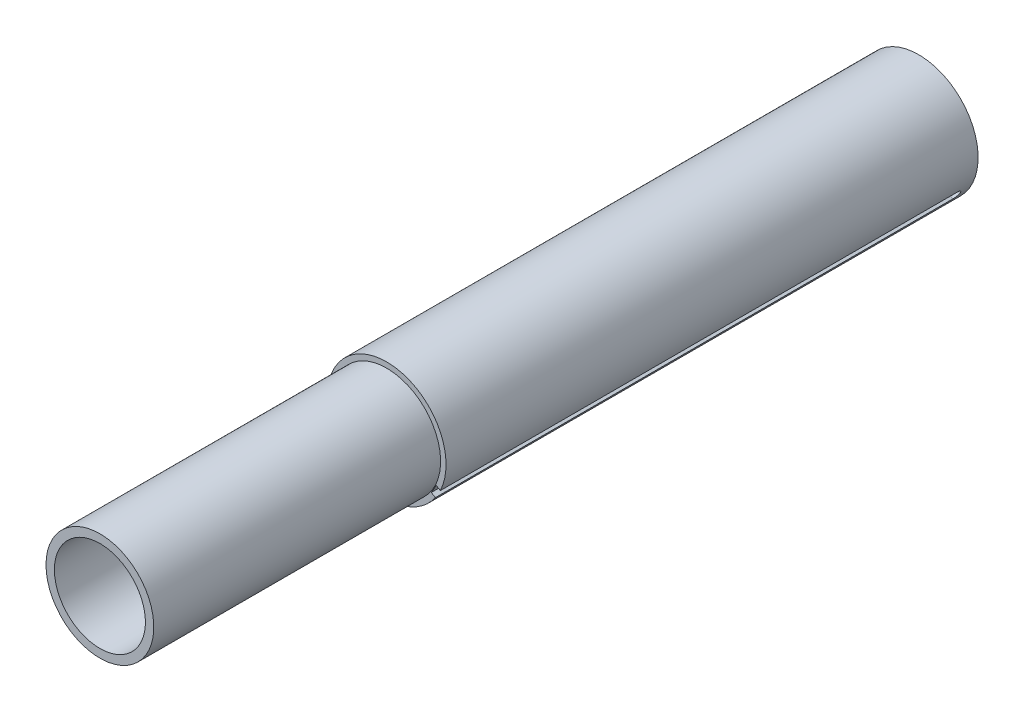
ISO-10303-21;
HEADER;
FILE_DESCRIPTION(('STEP AP214'),'2;1');
FILE_NAME('part.step','',(''),(''),'','','');
FILE_SCHEMA(('AUTOMOTIVE_DESIGN { 1 0 10303 214 1 1 1 1 }'));
ENDSEC;
DATA;
#1=APPLICATION_CONTEXT('core data for automotive mechanical design processes');
#2=APPLICATION_PROTOCOL_DEFINITION('international standard','automotive_design',2000,#1);
#3=PRODUCT_CONTEXT('',#1,'mechanical');
#4=PRODUCT('Part','Part','',(#3));
#5=PRODUCT_RELATED_PRODUCT_CATEGORY('part','',(#4));
#6=PRODUCT_DEFINITION_FORMATION('','',#4);
#7=PRODUCT_DEFINITION_CONTEXT('part definition',#1,'design');
#8=PRODUCT_DEFINITION('design','',#6,#7);
#9=PRODUCT_DEFINITION_SHAPE('','',#8);
#10=(LENGTH_UNIT() NAMED_UNIT(*) SI_UNIT(.MILLI.,.METRE.));
#11=(NAMED_UNIT(*) PLANE_ANGLE_UNIT() SI_UNIT($,.RADIAN.));
#12=(NAMED_UNIT(*) SI_UNIT($,.STERADIAN.) SOLID_ANGLE_UNIT());
#13=UNCERTAINTY_MEASURE_WITH_UNIT(LENGTH_MEASURE(1.E-05),#10,'distance_accuracy_value','');
#14=(GEOMETRIC_REPRESENTATION_CONTEXT(3) GLOBAL_UNCERTAINTY_ASSIGNED_CONTEXT((#13)) GLOBAL_UNIT_ASSIGNED_CONTEXT((#10,
#11,#12)) REPRESENTATION_CONTEXT('',''));
#15=CARTESIAN_POINT('',(0.,0.,0.));
#16=DIRECTION('',(0.,0.,1.));
#17=DIRECTION('',(1.,0.,0.));
#18=AXIS2_PLACEMENT_3D('',#15,#16,#17);
#19=CARTESIAN_POINT('',(25.9807621135332,-15.,7.5));
#20=DIRECTION('',(-0.866025403784439,0.5,0.));
#21=DIRECTION('',(-0.353553390593274,-0.612372435695795,-0.707106781186547));
#22=AXIS2_PLACEMENT_3D('',#19,#20,#21);
#23=CYLINDRICAL_SURFACE('',#22,2.5);
#24=CARTESIAN_POINT('',(23.8156986040721,-13.75,7.5));
#25=DIRECTION('',(0.866025403784438,-0.5,0.));
#26=DIRECTION('',(0.353553390593274,0.612372435695794,-0.707106781186548));
#27=AXIS2_PLACEMENT_3D('',#24,#25,#26);
#28=CIRCLE('',#27,2.5);
#29=CARTESIAN_POINT('',(22.5656986040721,-15.9150635094611,7.5));
#30=VERTEX_POINT('',#29);
#31=CARTESIAN_POINT('',(25.0656986040721,-11.5849364905389,7.5));
#32=VERTEX_POINT('',#31);
#33=EDGE_CURVE('E40',#30,#32,#28,.T.);
#34=ORIENTED_EDGE('',*,*,#33,.F.);
#35=DIRECTION('',(0.866025403784439,-0.5,0.));
#36=VECTOR('',#35,1.);
#37=CARTESIAN_POINT('',(22.5656986040721,-15.9150635094611,7.5));
#38=LINE('',#37,#36);
#39=CARTESIAN_POINT('',(24.64039397151,-17.1128894383378,7.5));
#40=VERTEX_POINT('',#39);
#41=EDGE_CURVE('E11',#30,#40,#38,.T.);
#42=ORIENTED_EDGE('',*,*,#41,.T.);
#43=CARTESIAN_POINT('',(24.64039397151,-17.1128894383378,7.5));
#44=CARTESIAN_POINT('',(24.6403884353835,-17.1128941848092,7.42981522943532));
#45=CARTESIAN_POINT('',(24.6420857228502,-17.1104534467754,7.35963381954326));
#46=CARTESIAN_POINT('',(24.6488438288842,-17.1007181779133,7.21977549840864));
#47=CARTESIAN_POINT('',(24.6539044431613,-17.0934239418892,7.15009855678424));
#48=CARTESIAN_POINT('',(24.6673414592063,-17.0740269822005,7.01179632427735));
#49=CARTESIAN_POINT('',(24.6757150765285,-17.0619282964512,6.94317020040563));
#50=CARTESIAN_POINT('',(24.6956861444105,-17.0330088861106,6.8074184368592));
#51=CARTESIAN_POINT('',(24.7072835645603,-17.0161882060617,6.74029278303704));
#52=CARTESIAN_POINT('',(24.7467710527772,-16.9587592785154,6.54182084308832));
#53=CARTESIAN_POINT('',(24.7793627238769,-16.9111750423097,6.4133148508315));
#54=CARTESIAN_POINT('',(24.8557798690659,-16.7986546782702,6.16787448999733));
#55=CARTESIAN_POINT('',(24.8996032417607,-16.7337217961843,6.05093796249768));
#56=CARTESIAN_POINT('',(24.9969641731087,-16.5879312265294,5.83155896979799));
#57=CARTESIAN_POINT('',(25.0505218928942,-16.5070404577821,5.72914738644036));
#58=CARTESIAN_POINT('',(25.1653695144093,-16.3314164205854,5.54197997692667));
#59=CARTESIAN_POINT('',(25.2266623344595,-16.2366779254804,5.45723084667699));
#60=CARTESIAN_POINT('',(25.3549359309489,-16.0356308999971,5.3076911335739));
#61=CARTESIAN_POINT('',(25.4219270470133,-15.9293012344825,5.24293786313374));
#62=CARTESIAN_POINT('',(25.5591953492763,-15.7081000396973,5.13552011598738));
#63=CARTESIAN_POINT('',(25.6294686037927,-15.5932386379001,5.09282991413465));
#64=CARTESIAN_POINT('',(25.7469460898471,-15.3981495627676,5.04124942910645));
#65=CARTESIAN_POINT('',(25.7938703039803,-15.3194242186378,5.02580218079675));
#66=CARTESIAN_POINT('',(25.8875690792169,-15.1605499165432,5.00517538689212));
#67=CARTESIAN_POINT('',(25.9343436376423,-15.0804009332696,4.99999602402012));
#68=CARTESIAN_POINT('',(26.0508468389526,-14.878607015342,5.0000060031152));
#69=CARTESIAN_POINT('',(26.1201198267564,-14.7566396770745,5.01182811826331));
#70=CARTESIAN_POINT('',(26.2550967127809,-14.5151332885649,5.05881307029779));
#71=CARTESIAN_POINT('',(26.3207967039827,-14.3955969825852,5.09400092330285));
#72=CARTESIAN_POINT('',(26.4468896226474,-14.1626116400843,5.18669220362722));
#73=CARTESIAN_POINT('',(26.5072854428025,-14.0491592989134,5.24418337371847));
#74=CARTESIAN_POINT('',(26.6214119062575,-13.8316857023721,5.37982895661882));
#75=CARTESIAN_POINT('',(26.6751437853639,-13.7276626993271,5.457979529765));
#76=CARTESIAN_POINT('',(26.7749618650594,-13.531944893467,5.63293573167592));
#77=CARTESIAN_POINT('',(26.8210307747341,-13.4402780574093,5.72978251186346));
#78=CARTESIAN_POINT('',(26.9045170040624,-13.2723690572968,5.93930395658546));
#79=CARTESIAN_POINT('',(26.9419336150195,-13.1961281568208,6.05197991644964));
#80=CARTESIAN_POINT('',(27.0075248387874,-13.0613647286156,6.29017249294597));
#81=CARTESIAN_POINT('',(27.0356836426351,-13.0028725221787,6.41571059900954));
#82=CARTESIAN_POINT('',(27.0822122881252,-12.9056847515567,6.67590523787045));
#83=CARTESIAN_POINT('',(27.1005873795528,-12.8669785709493,6.81055683670242));
#84=CARTESIAN_POINT('',(27.1227443758382,-12.820185666283,7.03835589018593));
#85=CARTESIAN_POINT('',(27.1293632584423,-12.8061638785454,7.13006199645121));
#86=CARTESIAN_POINT('',(27.1381853955714,-12.7874517961295,7.31449900176287));
#87=CARTESIAN_POINT('',(27.1403949057801,-12.7827482814602,7.40722826102696));
#88=CARTESIAN_POINT('',(27.14039397151,-12.7827624194157,7.5));
#89=B_SPLINE_CURVE_WITH_KNOTS('',3,(#43,#44,#45,#46,#47,#48,#49,#50,#51,#52,#53,#54,#55,#56,#57,
#58,#59,#60,#61,#62,#63,#64,#65,#66,#67,#68,#69,#70,#71,#72,#73,#74,#75,#76,#77,#78,#79,#80,#81,
#82,#83,#84,#85,#86,#87,#88),.UNSPECIFIED.,.F.,.F.,(4,2,2,2,2,2,2,2,2,2,2,2,2,2,2,2,2,2,2,2,2,2,
4),(0.,0.210485350684417,0.420957917543176,0.631253965167874,0.841548029142314,1.2619416149038,
1.68225660448838,2.10345225340323,2.52480728996931,2.94694389199121,3.3685871734244,
3.64687349634521,3.92516477148704,4.3453415918292,4.76596899401764,5.18636555884306,
5.60668404553526,6.02793844842368,6.44922734340521,6.87123195431885,7.29300989544704,
7.57149267143948,7.84958007548542),.UNSPECIFIED.);
#90=CARTESIAN_POINT('',(27.14039397151,-12.7827624194157,7.5));
#91=VERTEX_POINT('',#90);
#92=EDGE_CURVE('E32',#40,#91,#89,.T.);
#93=ORIENTED_EDGE('',*,*,#92,.T.);
#94=DIRECTION('',(-0.866025403784438,0.500000000000001,0.));
#95=VECTOR('',#94,1.);
#96=CARTESIAN_POINT('',(27.14039397151,-12.7827624194157,7.5));
#97=LINE('',#96,#95);
#98=EDGE_CURVE('E118',#91,#32,#97,.T.);
#99=ORIENTED_EDGE('',*,*,#98,.T.);
#100=EDGE_LOOP('',(#34,#42,#93,#99));
#101=FACE_BOUND('',#100,.T.);
#102=ADVANCED_FACE('F17',(#101),#23,.F.);
#103=CARTESIAN_POINT('',(23.8156986040721,-13.75,137.));
#104=DIRECTION('',(-0.866025403784439,0.5,0.));
#105=DIRECTION('',(0.,0.,1.));
#106=AXIS2_PLACEMENT_3D('',#103,#104,#105);
#107=PLANE('',#106);
#108=ORIENTED_EDGE('',*,*,#33,.T.);
#109=DIRECTION('',(0.,0.,1.));
#110=VECTOR('',#109,1.);
#111=CARTESIAN_POINT('',(25.0656986040721,-11.5849364905389,7.5));
#112=LINE('',#111,#110);
#113=CARTESIAN_POINT('',(25.0656986040721,-11.5849364905389,269.));
#114=VERTEX_POINT('',#113);
#115=EDGE_CURVE('E146',#32,#114,#112,.T.);
#116=ORIENTED_EDGE('',*,*,#115,.T.);
#117=DIRECTION('',(0.5,0.866025403784438,0.));
#118=VECTOR('',#117,1.);
#119=CARTESIAN_POINT('',(22.5656986040721,-15.915063509461,269.));
#120=LINE('',#119,#118);
#121=CARTESIAN_POINT('',(22.5656986040721,-15.915063509461,269.));
#122=VERTEX_POINT('',#121);
#123=EDGE_CURVE('E179',#122,#114,#120,.T.);
#124=ORIENTED_EDGE('',*,*,#123,.F.);
#125=DIRECTION('',(0.,0.,-1.));
#126=VECTOR('',#125,1.);
#127=CARTESIAN_POINT('',(22.5656986040721,-15.915063509461,269.));
#128=LINE('',#127,#126);
#129=EDGE_CURVE('E149',#122,#30,#128,.T.);
#130=ORIENTED_EDGE('',*,*,#129,.T.);
#131=EDGE_LOOP('',(#108,#116,#124,#130));
#132=FACE_BOUND('',#131,.T.);
#133=ADVANCED_FACE('F124',(#132),#107,.F.);
#134=CARTESIAN_POINT('',(24.7307621135332,-17.165063509461,269.));
#135=DIRECTION('',(-0.5,-0.866025403784439,0.));
#136=DIRECTION('',(0.,0.,1.));
#137=AXIS2_PLACEMENT_3D('',#134,#135,#136);
#138=PLANE('',#137);
#139=ORIENTED_EDGE('',*,*,#41,.F.);
#140=ORIENTED_EDGE('',*,*,#129,.F.);
#141=DIRECTION('',(-0.866025403784439,0.5,0.));
#142=VECTOR('',#141,1.);
#143=CARTESIAN_POINT('',(24.64039397151,-17.1128894383378,269.));
#144=LINE('',#143,#142);
#145=CARTESIAN_POINT('',(24.64039397151,-17.1128894383378,269.));
#146=VERTEX_POINT('',#145);
#147=EDGE_CURVE('E173',#146,#122,#144,.T.);
#148=ORIENTED_EDGE('',*,*,#147,.F.);
#149=DIRECTION('',(0.,0.,1.));
#150=VECTOR('',#149,1.);
#151=CARTESIAN_POINT('',(24.64039397151,-17.1128894383378,7.5));
#152=LINE('',#151,#150);
#153=EDGE_CURVE('E150',#40,#146,#152,.T.);
#154=ORIENTED_EDGE('',*,*,#153,.F.);
#155=EDGE_LOOP('',(#139,#140,#148,#154));
#156=FACE_BOUND('',#155,.T.);
#157=ADVANCED_FACE('F127',(#156),#138,.F.);
#158=CARTESIAN_POINT('',(27.2307621135332,-12.8349364905389,5.));
#159=DIRECTION('',(0.5,0.866025403784439,0.));
#160=DIRECTION('',(0.,0.,-1.));
#161=AXIS2_PLACEMENT_3D('',#158,#159,#160);
#162=PLANE('',#161);
#163=ORIENTED_EDGE('',*,*,#98,.F.);
#164=DIRECTION('',(0.,0.,-1.));
#165=VECTOR('',#164,1.);
#166=CARTESIAN_POINT('',(27.14039397151,-12.7827624194157,269.));
#167=LINE('',#166,#165);
#168=CARTESIAN_POINT('',(27.14039397151,-12.7827624194156,269.));
#169=VERTEX_POINT('',#168);
#170=EDGE_CURVE('E143',#169,#91,#167,.T.);
#171=ORIENTED_EDGE('',*,*,#170,.F.);
#172=DIRECTION('',(0.866025403784439,-0.5,0.));
#173=VECTOR('',#172,1.);
#174=CARTESIAN_POINT('',(25.0656986040721,-11.5849364905389,269.));
#175=LINE('',#174,#173);
#176=EDGE_CURVE('E171',#114,#169,#175,.T.);
#177=ORIENTED_EDGE('',*,*,#176,.F.);
#178=ORIENTED_EDGE('',*,*,#115,.F.);
#179=EDGE_LOOP('',(#163,#171,#177,#178));
#180=FACE_BOUND('',#179,.T.);
#181=ADVANCED_FACE('F130',(#180),#162,.F.);
#182=CARTESIAN_POINT('',(0.,0.,0.));
#183=DIRECTION('',(0.,0.,1.));
#184=DIRECTION('',(-1.,0.,0.));
#185=AXIS2_PLACEMENT_3D('',#182,#183,#184);
#186=CYLINDRICAL_SURFACE('',#185,30.);
#187=CARTESIAN_POINT('',(0.,0.,0.));
#188=DIRECTION('',(0.,0.,-1.));
#189=DIRECTION('',(-1.,0.,0.));
#190=AXIS2_PLACEMENT_3D('',#187,#188,#189);
#191=CIRCLE('',#190,30.);
#192=CARTESIAN_POINT('',(-30.,0.,0.));
#193=VERTEX_POINT('',#192);
#194=EDGE_CURVE('E183',#193,#193,#191,.T.);
#195=ORIENTED_EDGE('',*,*,#194,.F.);
#196=EDGE_LOOP('',(#195));
#197=FACE_BOUND('',#196,.T.);
#198=ORIENTED_EDGE('',*,*,#170,.T.);
#199=ORIENTED_EDGE('',*,*,#92,.F.);
#200=ORIENTED_EDGE('',*,*,#153,.T.);
#201=CARTESIAN_POINT('',(0.,0.,269.));
#202=DIRECTION('',(0.,0.,-1.));
#203=DIRECTION('',(-1.,0.,0.));
#204=AXIS2_PLACEMENT_3D('',#201,#202,#203);
#205=CIRCLE('',#204,30.);
#206=CARTESIAN_POINT('',(2.50000000000005,-29.8956518577535,269.));
#207=VERTEX_POINT('',#206);
#208=EDGE_CURVE('E101',#146,#207,#205,.T.);
#209=ORIENTED_EDGE('',*,*,#208,.T.);
#210=DIRECTION('',(0.,0.,-1.));
#211=VECTOR('',#210,1.);
#212=CARTESIAN_POINT('',(2.5,-29.8956518577535,269.));
#213=LINE('',#212,#211);
#214=CARTESIAN_POINT('',(2.5,-29.8956518577535,7.5));
#215=VERTEX_POINT('',#214);
#216=EDGE_CURVE('E96',#207,#215,#213,.T.);
#217=ORIENTED_EDGE('',*,*,#216,.T.);
#218=CARTESIAN_POINT('',(-2.5,-29.8956518577535,7.5));
#219=CARTESIAN_POINT('',(-2.50000687862803,-29.895649436563,7.42981522943532));
#220=CARTESIAN_POINT('',(-2.49704449375335,-29.8958989616098,7.35963381954326));
#221=CARTESIAN_POINT('',(-2.48523445058915,-29.8968840186857,7.21977549840864));
#222=CARTESIAN_POINT('',(-2.47638714975257,-29.8976195211964,7.15009855678424));
#223=CARTESIAN_POINT('',(-2.45287038188342,-29.899557838598,7.01179632427735));
#224=CARTESIAN_POINT('',(-2.43820580401107,-29.9007602610459,6.94317020040563));
#225=CARTESIAN_POINT('',(-2.40317532605262,-29.9035960080022,6.8074184368592));
#226=CARTESIAN_POINT('',(-2.38280947974644,-29.9052293284458,6.74029278303704));
#227=CARTESIAN_POINT('',(-2.31333082547075,-29.9107120326002,6.54182084308832));
#228=CARTESIAN_POINT('',(-2.25582583254711,-29.9151451296213,6.4133148508315));
#229=CARTESIAN_POINT('',(-2.12017176625135,-29.9250641366201,6.16787448999733));
#230=CARTESIAN_POINT('',(-2.04202655447667,-29.9305498496103,6.05093796249768));
#231=CARTESIAN_POINT('',(-1.86708775184922,-29.9419716046663,5.83155896979799));
#232=CARTESIAN_POINT('',(-1.77025543128969,-29.9479085661957,5.72914738644036));
#233=CARTESIAN_POINT('',(-1.56073674280468,-29.9595575053936,5.54197997692667));
#234=CARTESIAN_POINT('',(-1.44804438930233,-29.9652693970742,5.45723084667699));
#235=CARTESIAN_POINT('',(-1.20979575963375,-29.9758340775271,5.3076911335739));
#236=CARTESIAN_POINT('',(-1.08421601009003,-29.9806852531095,5.24293786313374));
#237=CARTESIAN_POINT('',(-0.824016004927105,-29.988962492611,5.13552011598738));
#238=CARTESIAN_POINT('',(-0.689406485798195,-29.9923902153302,5.09282991413465));
#239=CARTESIAN_POINT('',(-0.461715647705447,-29.9965841650598,5.04124942910645));
#240=CARTESIAN_POINT('',(-0.370075392700766,-29.9978590544869,5.02580218079675));
#241=CARTESIAN_POINT('',(-0.185636823460033,-29.999567423098,5.00517538689212));
#242=CARTESIAN_POINT('',(-0.092838488644856,-30.0000008873084,4.99999602402012));
#243=CARTESIAN_POINT('',(0.140171771264789,-29.9999986603015,5.0000060031152));
#244=CARTESIAN_POINT('',(0.280435078538241,-29.9990071584019,5.01182811826331));
#245=CARTESIAN_POINT('',(0.557074189176104,-29.995147376368,5.05881307029779));
#246=CARTESIAN_POINT('',(0.693445662429917,-29.9922770847874,5.09400092330285));
#247=CARTESIAN_POINT('',(0.958263347077515,-29.9849840843378,5.18669220362722));
#248=CARTESIAN_POINT('',(1.08671386672782,-29.9805622282891,5.24418337371847));
#249=CARTESIAN_POINT('',(1.33211475771249,-29.9706618466146,5.37982895661882));
#250=CARTESIAN_POINT('',(1.44906726048065,-29.9651835173913,5.457979529765));
#251=CARTESIAN_POINT('',(1.66847289217615,-29.9537696072346,5.63293573167592));
#252=CARTESIAN_POINT('',(1.77089315572405,-29.9478330353086,5.72978251186345));
#253=CARTESIAN_POINT('',(1.9580497300097,-29.9361797307168,5.93930395658546));
#254=CARTESIAN_POINT('',(2.04278459210787,-29.9304630160912,6.05197991644964));
#255=CARTESIAN_POINT('',(2.19228875631856,-29.9198849680369,6.29017249294597));
#256=CARTESIAN_POINT('',(2.25702389494021,-29.9150251042908,6.41571059900954));
#257=CARTESIAN_POINT('',(2.36445529598102,-29.9067262079779,6.67590523787045));
#258=CARTESIAN_POINT('',(2.40716337738437,-29.9032864136473,6.81055683670242));
#259=CARTESIAN_POINT('',(2.45876571968489,-29.8990784829689,7.03835589018593));
#260=CARTESIAN_POINT('',(2.4742183853742,-29.8977997095799,7.13006199645121));
#261=CARTESIAN_POINT('',(2.49483459266864,-29.8960838632415,7.31449900176287));
#262=CARTESIAN_POINT('',(2.50001271096369,-29.8956455978774,7.40722826102696));
#263=CARTESIAN_POINT('',(2.5,-29.8956518577535,7.5));
#264=B_SPLINE_CURVE_WITH_KNOTS('',3,(#218,#219,#220,#221,#222,#223,#224,#225,#226,#227,#228,
#229,#230,#231,#232,#233,#234,#235,#236,#237,#238,#239,#240,#241,#242,#243,#244,#245,#246,#247,
#248,#249,#250,#251,#252,#253,#254,#255,#256,#257,#258,#259,#260,#261,#262,#263),.UNSPECIFIED.,
.F.,.F.,(4,2,2,2,2,2,2,2,2,2,2,2,2,2,2,2,2,2,2,2,2,2,4),(0.,0.210485350684418,0.420957917543175,
0.631253965167871,0.841548029142314,1.2619416149038,1.68225660448838,2.10345225340323,
2.52480728996931,2.94694389199121,3.3685871734244,3.64687349634521,3.92516477148704,
4.3453415918292,4.76596899401764,5.18636555884306,5.60668404553526,6.02793844842368,
6.44922734340521,6.87123195431885,7.29300989544704,7.57149267143948,7.84958007548542),.UNSPECIFIED.);
#265=CARTESIAN_POINT('',(-2.5,-29.8956518577535,7.5));
#266=VERTEX_POINT('',#265);
#267=EDGE_CURVE('E21',#266,#215,#264,.T.);
#268=ORIENTED_EDGE('',*,*,#267,.F.);
#269=DIRECTION('',(0.,0.,1.));
#270=VECTOR('',#269,1.);
#271=CARTESIAN_POINT('',(-2.5,-29.8956518577535,7.5));
#272=LINE('',#271,#270);
#273=CARTESIAN_POINT('',(-2.49999999999992,-29.8956518577535,269.));
#274=VERTEX_POINT('',#273);
#275=EDGE_CURVE('E105',#266,#274,#272,.T.);
#276=ORIENTED_EDGE('',*,*,#275,.T.);
#277=CARTESIAN_POINT('',(0.,0.,269.));
#278=DIRECTION('',(0.,0.,-1.));
#279=DIRECTION('',(-1.,0.,0.));
#280=AXIS2_PLACEMENT_3D('',#277,#278,#279);
#281=CIRCLE('',#280,30.);
#282=EDGE_CURVE('E148',#274,#169,#281,.T.);
#283=ORIENTED_EDGE('',*,*,#282,.T.);
#284=EDGE_LOOP('',(#198,#199,#200,#209,#217,#268,#276,#283));
#285=FACE_BOUND('',#284,.T.);
#286=ADVANCED_FACE('F98',(#197,#285),#186,.T.);
#287=CARTESIAN_POINT('',(0.,-30.,7.5));
#288=DIRECTION('',(0.,1.,0.));
#289=DIRECTION('',(-0.707106781186548,0.,-0.707106781186548));
#290=AXIS2_PLACEMENT_3D('',#287,#288,#289);
#291=CYLINDRICAL_SURFACE('',#290,2.5);
#292=CARTESIAN_POINT('',(0.,-27.5,7.5));
#293=DIRECTION('',(0.,-1.,0.));
#294=DIRECTION('',(0.707106781186548,0.,-0.707106781186548));
#295=AXIS2_PLACEMENT_3D('',#292,#293,#294);
#296=CIRCLE('',#295,2.5);
#297=CARTESIAN_POINT('',(-2.5,-27.5,7.5));
#298=VERTEX_POINT('',#297);
#299=CARTESIAN_POINT('',(2.5,-27.5,7.5));
#300=VERTEX_POINT('',#299);
#301=EDGE_CURVE('E110',#298,#300,#296,.T.);
#302=ORIENTED_EDGE('',*,*,#301,.F.);
#303=DIRECTION('',(0.,-1.,0.));
#304=VECTOR('',#303,1.);
#305=CARTESIAN_POINT('',(-2.5,-27.5,7.5));
#306=LINE('',#305,#304);
#307=EDGE_CURVE('E94',#298,#266,#306,.T.);
#308=ORIENTED_EDGE('',*,*,#307,.T.);
#309=ORIENTED_EDGE('',*,*,#267,.T.);
#310=DIRECTION('',(0.,1.,0.));
#311=VECTOR('',#310,1.);
#312=CARTESIAN_POINT('',(2.5,-29.8956518577535,7.5));
#313=LINE('',#312,#311);
#314=EDGE_CURVE('E91',#215,#300,#313,.T.);
#315=ORIENTED_EDGE('',*,*,#314,.T.);
#316=EDGE_LOOP('',(#302,#308,#309,#315));
#317=FACE_BOUND('',#316,.T.);
#318=ADVANCED_FACE('F89',(#317),#291,.F.);
#319=CARTESIAN_POINT('',(0.,-27.5,137.));
#320=DIRECTION('',(0.,1.,0.));
#321=DIRECTION('',(0.,0.,1.));
#322=AXIS2_PLACEMENT_3D('',#319,#320,#321);
#323=PLANE('',#322);
#324=ORIENTED_EDGE('',*,*,#301,.T.);
#325=DIRECTION('',(0.,0.,1.));
#326=VECTOR('',#325,1.);
#327=CARTESIAN_POINT('',(2.5,-27.5,7.5));
#328=LINE('',#327,#326);
#329=CARTESIAN_POINT('',(2.50000000000005,-27.5,269.));
#330=VERTEX_POINT('',#329);
#331=EDGE_CURVE('E109',#300,#330,#328,.T.);
#332=ORIENTED_EDGE('',*,*,#331,.T.);
#333=DIRECTION('',(1.,0.,0.));
#334=VECTOR('',#333,1.);
#335=CARTESIAN_POINT('',(-2.49999999999992,-27.5,269.));
#336=LINE('',#335,#334);
#337=CARTESIAN_POINT('',(-2.49999999999992,-27.5,269.));
#338=VERTEX_POINT('',#337);
#339=EDGE_CURVE('E162',#338,#330,#336,.T.);
#340=ORIENTED_EDGE('',*,*,#339,.F.);
#341=DIRECTION('',(0.,0.,-1.));
#342=VECTOR('',#341,1.);
#343=CARTESIAN_POINT('',(-2.49999999999992,-27.5,269.));
#344=LINE('',#343,#342);
#345=EDGE_CURVE('E161',#338,#298,#344,.T.);
#346=ORIENTED_EDGE('',*,*,#345,.T.);
#347=EDGE_LOOP('',(#324,#332,#340,#346));
#348=FACE_BOUND('',#347,.T.);
#349=ADVANCED_FACE('F205',(#348),#323,.F.);
#350=CARTESIAN_POINT('',(-2.49999999999992,-30.,269.));
#351=DIRECTION('',(-1.,0.,0.));
#352=DIRECTION('',(0.,0.,1.));
#353=AXIS2_PLACEMENT_3D('',#350,#351,#352);
#354=PLANE('',#353);
#355=ORIENTED_EDGE('',*,*,#307,.F.);
#356=ORIENTED_EDGE('',*,*,#345,.F.);
#357=DIRECTION('',(0.,1.,0.));
#358=VECTOR('',#357,1.);
#359=CARTESIAN_POINT('',(-2.49999999999992,-29.8956518577535,269.));
#360=LINE('',#359,#358);
#361=EDGE_CURVE('E164',#274,#338,#360,.T.);
#362=ORIENTED_EDGE('',*,*,#361,.F.);
#363=ORIENTED_EDGE('',*,*,#275,.F.);
#364=EDGE_LOOP('',(#355,#356,#362,#363));
#365=FACE_BOUND('',#364,.T.);
#366=ADVANCED_FACE('F207',(#365),#354,.F.);
#367=CARTESIAN_POINT('',(2.5,-30.,5.));
#368=DIRECTION('',(1.,0.,0.));
#369=DIRECTION('',(0.,0.,-1.));
#370=AXIS2_PLACEMENT_3D('',#367,#368,#369);
#371=PLANE('',#370);
#372=ORIENTED_EDGE('',*,*,#314,.F.);
#373=ORIENTED_EDGE('',*,*,#216,.F.);
#374=DIRECTION('',(0.,-1.,0.));
#375=VECTOR('',#374,1.);
#376=CARTESIAN_POINT('',(2.50000000000005,-27.5,269.));
#377=LINE('',#376,#375);
#378=EDGE_CURVE('E165',#330,#207,#377,.T.);
#379=ORIENTED_EDGE('',*,*,#378,.F.);
#380=ORIENTED_EDGE('',*,*,#331,.F.);
#381=EDGE_LOOP('',(#372,#373,#379,#380));
#382=FACE_BOUND('',#381,.T.);
#383=ADVANCED_FACE('F107',(#382),#371,.F.);
#384=CARTESIAN_POINT('',(0.,0.,414.));
#385=DIRECTION('',(0.,0.,-1.));
#386=DIRECTION('',(-1.,0.,0.));
#387=AXIS2_PLACEMENT_3D('',#384,#385,#386);
#388=CYLINDRICAL_SURFACE('',#387,27.25);
#389=CARTESIAN_POINT('',(0.,0.,269.));
#390=DIRECTION('',(0.,0.,1.));
#391=DIRECTION('',(-1.,0.,0.));
#392=AXIS2_PLACEMENT_3D('',#389,#390,#391);
#393=CIRCLE('',#392,27.25);
#394=CARTESIAN_POINT('',(-27.25,0.,269.));
#395=VERTEX_POINT('',#394);
#396=EDGE_CURVE('E168',#395,#395,#393,.T.);
#397=ORIENTED_EDGE('',*,*,#396,.T.);
#398=EDGE_LOOP('',(#397));
#399=FACE_BOUND('',#398,.T.);
#400=CARTESIAN_POINT('',(0.,0.,414.));
#401=DIRECTION('',(0.,0.,1.));
#402=DIRECTION('',(-1.,0.,0.));
#403=AXIS2_PLACEMENT_3D('',#400,#401,#402);
#404=CIRCLE('',#403,27.25);
#405=CARTESIAN_POINT('',(-27.25,0.,414.));
#406=VERTEX_POINT('',#405);
#407=EDGE_CURVE('E176',#406,#406,#404,.T.);
#408=ORIENTED_EDGE('',*,*,#407,.F.);
#409=EDGE_LOOP('',(#408));
#410=FACE_BOUND('',#409,.T.);
#411=ADVANCED_FACE('F214',(#399,#410),#388,.T.);
#412=CARTESIAN_POINT('',(0.,0.,269.));
#413=DIRECTION('',(0.,0.,-1.));
#414=DIRECTION('',(-1.,0.,0.));
#415=AXIS2_PLACEMENT_3D('',#412,#413,#414);
#416=PLANE('',#415);
#417=ORIENTED_EDGE('',*,*,#176,.T.);
#418=ORIENTED_EDGE('',*,*,#282,.F.);
#419=ORIENTED_EDGE('',*,*,#361,.T.);
#420=ORIENTED_EDGE('',*,*,#339,.T.);
#421=ORIENTED_EDGE('',*,*,#378,.T.);
#422=ORIENTED_EDGE('',*,*,#208,.F.);
#423=ORIENTED_EDGE('',*,*,#147,.T.);
#424=ORIENTED_EDGE('',*,*,#123,.T.);
#425=EDGE_LOOP('',(#417,#418,#419,#420,#421,#422,#423,#424));
#426=FACE_BOUND('',#425,.T.);
#427=ORIENTED_EDGE('',*,*,#396,.F.);
#428=EDGE_LOOP('',(#427));
#429=FACE_BOUND('',#428,.T.);
#430=ADVANCED_FACE('F200',(#426,#429),#416,.F.);
#431=CARTESIAN_POINT('',(0.,0.,0.));
#432=DIRECTION('',(0.,0.,1.));
#433=DIRECTION('',(-1.,0.,0.));
#434=AXIS2_PLACEMENT_3D('',#431,#432,#433);
#435=CYLINDRICAL_SURFACE('',#434,23.);
#436=CARTESIAN_POINT('',(0.,0.,414.));
#437=DIRECTION('',(0.,0.,-1.));
#438=DIRECTION('',(-1.,0.,0.));
#439=AXIS2_PLACEMENT_3D('',#436,#437,#438);
#440=CIRCLE('',#439,23.);
#441=CARTESIAN_POINT('',(-23.,0.,414.));
#442=VERTEX_POINT('',#441);
#443=EDGE_CURVE('E180',#442,#442,#440,.T.);
#444=ORIENTED_EDGE('',*,*,#443,.F.);
#445=EDGE_LOOP('',(#444));
#446=FACE_BOUND('',#445,.T.);
#447=CARTESIAN_POINT('',(0.,0.,0.));
#448=DIRECTION('',(0.,0.,1.));
#449=DIRECTION('',(-1.,0.,0.));
#450=AXIS2_PLACEMENT_3D('',#447,#448,#449);
#451=CIRCLE('',#450,23.);
#452=CARTESIAN_POINT('',(-23.,0.,0.));
#453=VERTEX_POINT('',#452);
#454=EDGE_CURVE('E184',#453,#453,#451,.T.);
#455=ORIENTED_EDGE('',*,*,#454,.F.);
#456=EDGE_LOOP('',(#455));
#457=FACE_BOUND('',#456,.T.);
#458=ADVANCED_FACE('F223',(#446,#457),#435,.F.);
#459=CARTESIAN_POINT('',(0.,0.,414.));
#460=DIRECTION('',(0.,0.,-1.));
#461=DIRECTION('',(-1.,0.,0.));
#462=AXIS2_PLACEMENT_3D('',#459,#460,#461);
#463=PLANE('',#462);
#464=ORIENTED_EDGE('',*,*,#407,.T.);
#465=EDGE_LOOP('',(#464));
#466=FACE_BOUND('',#465,.T.);
#467=ORIENTED_EDGE('',*,*,#443,.T.);
#468=EDGE_LOOP('',(#467));
#469=FACE_BOUND('',#468,.T.);
#470=ADVANCED_FACE('F225',(#466,#469),#463,.F.);
#471=CARTESIAN_POINT('',(0.,0.,0.));
#472=DIRECTION('',(0.,0.,-1.));
#473=DIRECTION('',(-1.,0.,0.));
#474=AXIS2_PLACEMENT_3D('',#471,#472,#473);
#475=PLANE('',#474);
#476=ORIENTED_EDGE('',*,*,#194,.T.);
#477=EDGE_LOOP('',(#476));
#478=FACE_BOUND('',#477,.T.);
#479=ORIENTED_EDGE('',*,*,#454,.T.);
#480=EDGE_LOOP('',(#479));
#481=FACE_BOUND('',#480,.T.);
#482=ADVANCED_FACE('F19',(#478,#481),#475,.T.);
#483=CLOSED_SHELL('',(#102,#133,#157,#181,#286,#318,#349,#366,#383,#411,#430,#458,#470,#482));
#484=MANIFOLD_SOLID_BREP('B1',#483);
#485=ADVANCED_BREP_SHAPE_REPRESENTATION('',(#18,#484),#14);
#486=SHAPE_DEFINITION_REPRESENTATION(#9,#485);
ENDSEC;
END-ISO-10303-21;
